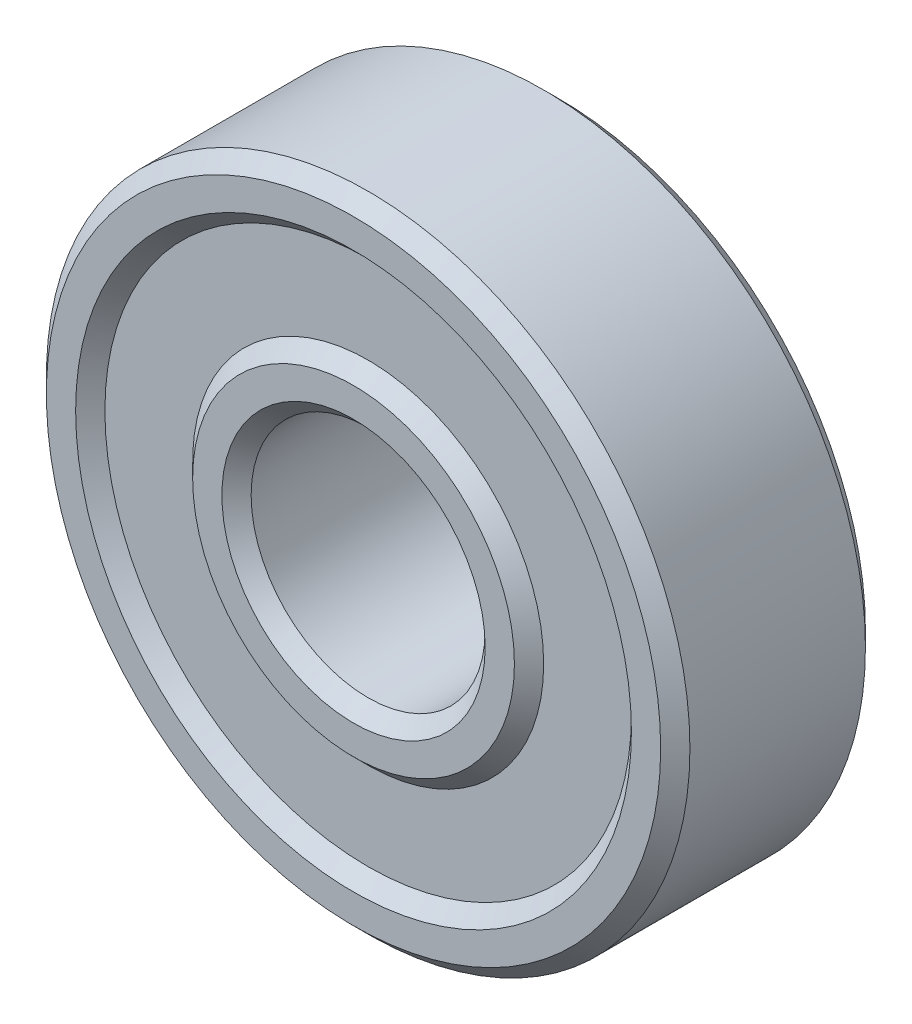
ISO-10303-21;
HEADER;
FILE_DESCRIPTION(('STEP AP214'),'2;1');
FILE_NAME('part.step','',(''),(''),'','','');
FILE_SCHEMA(('AUTOMOTIVE_DESIGN { 1 0 10303 214 1 1 1 1 }'));
ENDSEC;
DATA;
#1=APPLICATION_CONTEXT('core data for automotive mechanical design processes');
#2=APPLICATION_PROTOCOL_DEFINITION('international standard','automotive_design',2000,#1);
#3=PRODUCT_CONTEXT('',#1,'mechanical');
#4=PRODUCT('Part','Part','',(#3));
#5=PRODUCT_RELATED_PRODUCT_CATEGORY('part','',(#4));
#6=PRODUCT_DEFINITION_FORMATION('','',#4);
#7=PRODUCT_DEFINITION_CONTEXT('part definition',#1,'design');
#8=PRODUCT_DEFINITION('design','',#6,#7);
#9=PRODUCT_DEFINITION_SHAPE('','',#8);
#10=(LENGTH_UNIT() NAMED_UNIT(*) SI_UNIT(.MILLI.,.METRE.));
#11=(NAMED_UNIT(*) PLANE_ANGLE_UNIT() SI_UNIT($,.RADIAN.));
#12=(NAMED_UNIT(*) SI_UNIT($,.STERADIAN.) SOLID_ANGLE_UNIT());
#13=UNCERTAINTY_MEASURE_WITH_UNIT(LENGTH_MEASURE(1.E-05),#10,'distance_accuracy_value','');
#14=(GEOMETRIC_REPRESENTATION_CONTEXT(3) GLOBAL_UNCERTAINTY_ASSIGNED_CONTEXT((#13)) GLOBAL_UNIT_ASSIGNED_CONTEXT((#10,
#11,#12)) REPRESENTATION_CONTEXT('',''));
#15=CARTESIAN_POINT('',(0.,0.,0.));
#16=DIRECTION('',(0.,0.,1.));
#17=DIRECTION('',(1.,0.,0.));
#18=AXIS2_PLACEMENT_3D('',#15,#16,#17);
#19=CARTESIAN_POINT('',(0.,0.,3.5));
#20=DIRECTION('',(0.,0.,1.));
#21=DIRECTION('',(1.,0.,0.));
#22=AXIS2_PLACEMENT_3D('',#19,#20,#21);
#23=PLANE('',#22);
#24=CARTESIAN_POINT('',(0.,0.,3.5));
#25=DIRECTION('',(0.,0.,1.));
#26=DIRECTION('',(1.,0.,0.));
#27=AXIS2_PLACEMENT_3D('',#24,#25,#26);
#28=CIRCLE('',#27,5.49999999999999);
#29=CARTESIAN_POINT('',(5.49999999999999,0.,3.5));
#30=VERTEX_POINT('',#29);
#31=EDGE_CURVE('E68',#30,#30,#28,.T.);
#32=ORIENTED_EDGE('',*,*,#31,.T.);
#33=EDGE_LOOP('',(#32));
#34=FACE_BOUND('',#33,.T.);
#35=CARTESIAN_POINT('',(0.,0.,3.5));
#36=DIRECTION('',(0.,0.,1.));
#37=DIRECTION('',(1.,0.,0.));
#38=AXIS2_PLACEMENT_3D('',#35,#36,#37);
#39=CIRCLE('',#38,4.5);
#40=CARTESIAN_POINT('',(4.5,0.,3.5));
#41=VERTEX_POINT('',#40);
#42=EDGE_CURVE('E71',#41,#41,#39,.F.);
#43=ORIENTED_EDGE('',*,*,#42,.T.);
#44=EDGE_LOOP('',(#43));
#45=FACE_BOUND('',#44,.T.);
#46=ADVANCED_FACE('F48',(#34,#45),#23,.T.);
#47=CARTESIAN_POINT('',(0.,0.,-3.5));
#48=DIRECTION('',(0.,0.,1.));
#49=DIRECTION('',(1.,0.,0.));
#50=AXIS2_PLACEMENT_3D('',#47,#48,#49);
#51=PLANE('',#50);
#52=CARTESIAN_POINT('',(0.,0.,-3.5));
#53=DIRECTION('',(0.,0.,1.));
#54=DIRECTION('',(1.,0.,0.));
#55=AXIS2_PLACEMENT_3D('',#52,#53,#54);
#56=CIRCLE('',#55,9.5);
#57=CARTESIAN_POINT('',(9.5,0.,-3.5));
#58=VERTEX_POINT('',#57);
#59=EDGE_CURVE('E86',#58,#58,#56,.T.);
#60=ORIENTED_EDGE('',*,*,#59,.T.);
#61=EDGE_LOOP('',(#60));
#62=FACE_BOUND('',#61,.T.);
#63=CARTESIAN_POINT('',(0.,0.,-3.5));
#64=DIRECTION('',(0.,0.,1.));
#65=DIRECTION('',(1.,0.,0.));
#66=AXIS2_PLACEMENT_3D('',#63,#64,#65);
#67=CIRCLE('',#66,10.5);
#68=CARTESIAN_POINT('',(10.5,0.,-3.5));
#69=VERTEX_POINT('',#68);
#70=EDGE_CURVE('E89',#69,#69,#67,.F.);
#71=ORIENTED_EDGE('',*,*,#70,.T.);
#72=EDGE_LOOP('',(#71));
#73=FACE_BOUND('',#72,.T.);
#74=ADVANCED_FACE('F131',(#62,#73),#51,.F.);
#75=CARTESIAN_POINT('',(0.,0.,3.5));
#76=DIRECTION('',(0.,0.,1.));
#77=DIRECTION('',(1.,0.,0.));
#78=AXIS2_PLACEMENT_3D('',#75,#76,#77);
#79=CIRCLE('',#78,9.49999999999999);
#80=CARTESIAN_POINT('',(9.49999999999999,0.,3.5));
#81=VERTEX_POINT('',#80);
#82=EDGE_CURVE('E59',#81,#81,#79,.F.);
#83=ORIENTED_EDGE('',*,*,#82,.T.);
#84=EDGE_LOOP('',(#83));
#85=FACE_BOUND('',#84,.T.);
#86=CARTESIAN_POINT('',(0.,0.,3.5));
#87=DIRECTION('',(0.,0.,1.));
#88=DIRECTION('',(1.,0.,0.));
#89=AXIS2_PLACEMENT_3D('',#86,#87,#88);
#90=CIRCLE('',#89,10.5);
#91=CARTESIAN_POINT('',(10.5,0.,3.5));
#92=VERTEX_POINT('',#91);
#93=EDGE_CURVE('E63',#92,#92,#90,.T.);
#94=ORIENTED_EDGE('',*,*,#93,.T.);
#95=EDGE_LOOP('',(#94));
#96=FACE_BOUND('',#95,.T.);
#97=ADVANCED_FACE('F134',(#85,#96),#23,.T.);
#98=CARTESIAN_POINT('',(0.,0.,-3.5));
#99=DIRECTION('',(0.,0.,1.));
#100=DIRECTION('',(1.,0.,0.));
#101=AXIS2_PLACEMENT_3D('',#98,#99,#100);
#102=CIRCLE('',#101,4.5);
#103=CARTESIAN_POINT('',(4.5,0.,-3.5));
#104=VERTEX_POINT('',#103);
#105=EDGE_CURVE('E80',#104,#104,#102,.T.);
#106=ORIENTED_EDGE('',*,*,#105,.T.);
#107=EDGE_LOOP('',(#106));
#108=FACE_BOUND('',#107,.T.);
#109=CARTESIAN_POINT('',(0.,0.,-3.5));
#110=DIRECTION('',(0.,0.,1.));
#111=DIRECTION('',(1.,0.,0.));
#112=AXIS2_PLACEMENT_3D('',#109,#110,#111);
#113=CIRCLE('',#112,5.5);
#114=CARTESIAN_POINT('',(5.5,0.,-3.5));
#115=VERTEX_POINT('',#114);
#116=EDGE_CURVE('E83',#115,#115,#113,.F.);
#117=ORIENTED_EDGE('',*,*,#116,.T.);
#118=EDGE_LOOP('',(#117));
#119=FACE_BOUND('',#118,.T.);
#120=ADVANCED_FACE('F140',(#108,#119),#51,.F.);
#121=CARTESIAN_POINT('',(0.,0.,3.5));
#122=DIRECTION('',(0.,0.,-1.));
#123=DIRECTION('',(-1.,0.,0.));
#124=AXIS2_PLACEMENT_3D('',#121,#122,#123);
#125=CYLINDRICAL_SURFACE('',#124,11.);
#126=CARTESIAN_POINT('',(0.,0.,-3.));
#127=DIRECTION('',(0.,0.,1.));
#128=DIRECTION('',(1.,0.,0.));
#129=AXIS2_PLACEMENT_3D('',#126,#127,#128);
#130=CIRCLE('',#129,11.);
#131=CARTESIAN_POINT('',(11.,0.,-3.));
#132=VERTEX_POINT('',#131);
#133=EDGE_CURVE('E11',#132,#132,#130,.T.);
#134=ORIENTED_EDGE('',*,*,#133,.T.);
#135=EDGE_LOOP('',(#134));
#136=FACE_BOUND('',#135,.T.);
#137=CARTESIAN_POINT('',(0.,0.,3.));
#138=DIRECTION('',(0.,0.,1.));
#139=DIRECTION('',(1.,0.,0.));
#140=AXIS2_PLACEMENT_3D('',#137,#138,#139);
#141=CIRCLE('',#140,11.);
#142=CARTESIAN_POINT('',(11.,0.,3.));
#143=VERTEX_POINT('',#142);
#144=EDGE_CURVE('E55',#143,#143,#141,.F.);
#145=ORIENTED_EDGE('',*,*,#144,.T.);
#146=EDGE_LOOP('',(#145));
#147=FACE_BOUND('',#146,.T.);
#148=ADVANCED_FACE('F148',(#136,#147),#125,.T.);
#149=CARTESIAN_POINT('',(0.,0.,3.5));
#150=DIRECTION('',(0.,0.,-1.));
#151=DIRECTION('',(-1.,0.,0.));
#152=AXIS2_PLACEMENT_3D('',#149,#150,#151);
#153=CYLINDRICAL_SURFACE('',#152,4.);
#154=CARTESIAN_POINT('',(0.,0.,-3.));
#155=DIRECTION('',(0.,0.,1.));
#156=DIRECTION('',(1.,0.,0.));
#157=AXIS2_PLACEMENT_3D('',#154,#155,#156);
#158=CIRCLE('',#157,4.);
#159=CARTESIAN_POINT('',(4.,0.,-3.));
#160=VERTEX_POINT('',#159);
#161=EDGE_CURVE('E74',#160,#160,#158,.F.);
#162=ORIENTED_EDGE('',*,*,#161,.T.);
#163=EDGE_LOOP('',(#162));
#164=FACE_BOUND('',#163,.T.);
#165=CARTESIAN_POINT('',(0.,0.,3.00000000000001));
#166=DIRECTION('',(0.,0.,1.));
#167=DIRECTION('',(1.,0.,0.));
#168=AXIS2_PLACEMENT_3D('',#165,#166,#167);
#169=CIRCLE('',#168,4.);
#170=CARTESIAN_POINT('',(4.,0.,3.00000000000001));
#171=VERTEX_POINT('',#170);
#172=EDGE_CURVE('E77',#171,#171,#169,.T.);
#173=ORIENTED_EDGE('',*,*,#172,.T.);
#174=EDGE_LOOP('',(#173));
#175=FACE_BOUND('',#174,.T.);
#176=ADVANCED_FACE('F214',(#164,#175),#153,.F.);
#177=CARTESIAN_POINT('',(0.,0.,-3.));
#178=DIRECTION('',(0.,0.,1.));
#179=DIRECTION('',(1.,0.,0.));
#180=AXIS2_PLACEMENT_3D('',#177,#178,#179);
#181=PLANE('',#180);
#182=CARTESIAN_POINT('',(0.,0.,-3.));
#183=DIRECTION('',(0.,0.,1.));
#184=DIRECTION('',(1.,0.,0.));
#185=AXIS2_PLACEMENT_3D('',#182,#183,#184);
#186=CIRCLE('',#185,9.);
#187=CARTESIAN_POINT('',(9.,0.,-3.));
#188=VERTEX_POINT('',#187);
#189=EDGE_CURVE('E92',#188,#188,#186,.T.);
#190=ORIENTED_EDGE('',*,*,#189,.F.);
#191=EDGE_LOOP('',(#190));
#192=FACE_BOUND('',#191,.T.);
#193=CARTESIAN_POINT('',(0.,0.,-3.));
#194=DIRECTION('',(0.,0.,1.));
#195=DIRECTION('',(1.,0.,0.));
#196=AXIS2_PLACEMENT_3D('',#193,#194,#195);
#197=CIRCLE('',#196,6.);
#198=CARTESIAN_POINT('',(6.,0.,-3.));
#199=VERTEX_POINT('',#198);
#200=EDGE_CURVE('E95',#199,#199,#197,.T.);
#201=ORIENTED_EDGE('',*,*,#200,.T.);
#202=EDGE_LOOP('',(#201));
#203=FACE_BOUND('',#202,.T.);
#204=ADVANCED_FACE('F112',(#192,#203),#181,.F.);
#205=CARTESIAN_POINT('',(0.,0.,3.));
#206=DIRECTION('',(0.,0.,1.));
#207=DIRECTION('',(1.,0.,0.));
#208=AXIS2_PLACEMENT_3D('',#205,#206,#207);
#209=PLANE('',#208);
#210=CARTESIAN_POINT('',(0.,0.,3.));
#211=DIRECTION('',(0.,0.,1.));
#212=DIRECTION('',(1.,0.,0.));
#213=AXIS2_PLACEMENT_3D('',#210,#211,#212);
#214=CIRCLE('',#213,6.);
#215=CARTESIAN_POINT('',(6.,0.,3.));
#216=VERTEX_POINT('',#215);
#217=EDGE_CURVE('E101',#216,#216,#214,.T.);
#218=ORIENTED_EDGE('',*,*,#217,.F.);
#219=EDGE_LOOP('',(#218));
#220=FACE_BOUND('',#219,.T.);
#221=CARTESIAN_POINT('',(0.,0.,3.));
#222=DIRECTION('',(0.,0.,1.));
#223=DIRECTION('',(1.,0.,0.));
#224=AXIS2_PLACEMENT_3D('',#221,#222,#223);
#225=CIRCLE('',#224,9.);
#226=CARTESIAN_POINT('',(9.,0.,3.));
#227=VERTEX_POINT('',#226);
#228=EDGE_CURVE('E98',#227,#227,#225,.T.);
#229=ORIENTED_EDGE('',*,*,#228,.T.);
#230=EDGE_LOOP('',(#229));
#231=FACE_BOUND('',#230,.T.);
#232=ADVANCED_FACE('F108',(#220,#231),#209,.T.);
#233=CARTESIAN_POINT('',(0.,0.,-3.5));
#234=DIRECTION('',(0.,0.,-1.));
#235=DIRECTION('',(-1.,0.,0.));
#236=AXIS2_PLACEMENT_3D('',#233,#234,#235);
#237=CONICAL_SURFACE('',#236,9.5,0.785398163397447);
#238=ORIENTED_EDGE('',*,*,#189,.T.);
#239=EDGE_LOOP('',(#238));
#240=FACE_BOUND('',#239,.T.);
#241=ORIENTED_EDGE('',*,*,#59,.F.);
#242=EDGE_LOOP('',(#241));
#243=FACE_BOUND('',#242,.T.);
#244=ADVANCED_FACE('F111',(#240,#243),#237,.F.);
#245=CARTESIAN_POINT('',(0.,0.,-3.5));
#246=DIRECTION('',(0.,0.,-1.));
#247=DIRECTION('',(-1.,0.,0.));
#248=AXIS2_PLACEMENT_3D('',#245,#246,#247);
#249=CONICAL_SURFACE('',#248,4.5,0.785398163397445);
#250=ORIENTED_EDGE('',*,*,#161,.F.);
#251=EDGE_LOOP('',(#250));
#252=FACE_BOUND('',#251,.T.);
#253=ORIENTED_EDGE('',*,*,#105,.F.);
#254=EDGE_LOOP('',(#253));
#255=FACE_BOUND('',#254,.T.);
#256=ADVANCED_FACE('F189',(#252,#255),#249,.F.);
#257=CARTESIAN_POINT('',(0.,0.,-3.));
#258=DIRECTION('',(0.,0.,1.));
#259=DIRECTION('',(1.,0.,0.));
#260=AXIS2_PLACEMENT_3D('',#257,#258,#259);
#261=CONICAL_SURFACE('',#260,6.,0.785398163397451);
#262=ORIENTED_EDGE('',*,*,#116,.F.);
#263=EDGE_LOOP('',(#262));
#264=FACE_BOUND('',#263,.T.);
#265=ORIENTED_EDGE('',*,*,#200,.F.);
#266=EDGE_LOOP('',(#265));
#267=FACE_BOUND('',#266,.T.);
#268=ADVANCED_FACE('F180',(#264,#267),#261,.T.);
#269=CARTESIAN_POINT('',(0.,0.,3.5));
#270=DIRECTION('',(0.,0.,-1.));
#271=DIRECTION('',(-1.,0.,0.));
#272=AXIS2_PLACEMENT_3D('',#269,#270,#271);
#273=CONICAL_SURFACE('',#272,5.49999999999999,0.785398163397448);
#274=ORIENTED_EDGE('',*,*,#217,.T.);
#275=EDGE_LOOP('',(#274));
#276=FACE_BOUND('',#275,.T.);
#277=ORIENTED_EDGE('',*,*,#31,.F.);
#278=EDGE_LOOP('',(#277));
#279=FACE_BOUND('',#278,.T.);
#280=ADVANCED_FACE('F105',(#276,#279),#273,.T.);
#281=CARTESIAN_POINT('',(0.,0.,3.00000000000001));
#282=DIRECTION('',(0.,0.,1.));
#283=DIRECTION('',(1.,0.,0.));
#284=AXIS2_PLACEMENT_3D('',#281,#282,#283);
#285=CONICAL_SURFACE('',#284,4.,0.785398163397452);
#286=ORIENTED_EDGE('',*,*,#42,.F.);
#287=EDGE_LOOP('',(#286));
#288=FACE_BOUND('',#287,.T.);
#289=ORIENTED_EDGE('',*,*,#172,.F.);
#290=EDGE_LOOP('',(#289));
#291=FACE_BOUND('',#290,.T.);
#292=ADVANCED_FACE('F119',(#288,#291),#285,.F.);
#293=CARTESIAN_POINT('',(0.,0.,3.00000000000001));
#294=DIRECTION('',(0.,0.,1.));
#295=DIRECTION('',(1.,0.,0.));
#296=AXIS2_PLACEMENT_3D('',#293,#294,#295);
#297=CONICAL_SURFACE('',#296,9.,0.785398163397452);
#298=ORIENTED_EDGE('',*,*,#82,.F.);
#299=EDGE_LOOP('',(#298));
#300=FACE_BOUND('',#299,.T.);
#301=ORIENTED_EDGE('',*,*,#228,.F.);
#302=EDGE_LOOP('',(#301));
#303=FACE_BOUND('',#302,.T.);
#304=ADVANCED_FACE('F116',(#300,#303),#297,.F.);
#305=CARTESIAN_POINT('',(0.,0.,-3.));
#306=DIRECTION('',(0.,0.,1.));
#307=DIRECTION('',(1.,0.,0.));
#308=AXIS2_PLACEMENT_3D('',#305,#306,#307);
#309=CONICAL_SURFACE('',#308,11.,0.785398163397452);
#310=ORIENTED_EDGE('',*,*,#70,.F.);
#311=EDGE_LOOP('',(#310));
#312=FACE_BOUND('',#311,.T.);
#313=ORIENTED_EDGE('',*,*,#133,.F.);
#314=EDGE_LOOP('',(#313));
#315=FACE_BOUND('',#314,.T.);
#316=ADVANCED_FACE('F118',(#312,#315),#309,.T.);
#317=CARTESIAN_POINT('',(0.,0.,3.5));
#318=DIRECTION('',(0.,0.,-1.));
#319=DIRECTION('',(-1.,0.,0.));
#320=AXIS2_PLACEMENT_3D('',#317,#318,#319);
#321=CONICAL_SURFACE('',#320,10.5,0.785398163397448);
#322=ORIENTED_EDGE('',*,*,#144,.F.);
#323=EDGE_LOOP('',(#322));
#324=FACE_BOUND('',#323,.T.);
#325=ORIENTED_EDGE('',*,*,#93,.F.);
#326=EDGE_LOOP('',(#325));
#327=FACE_BOUND('',#326,.T.);
#328=ADVANCED_FACE('F50',(#324,#327),#321,.T.);
#329=CLOSED_SHELL('',(#46,#74,#97,#120,#148,#176,#204,#232,#244,#256,#268,#280,#292,#304,#316,#328));
#330=MANIFOLD_SOLID_BREP('B2',#329);
#331=ADVANCED_BREP_SHAPE_REPRESENTATION('',(#18,#330),#14);
#332=SHAPE_DEFINITION_REPRESENTATION(#9,#331);
ENDSEC;
END-ISO-10303-21;
